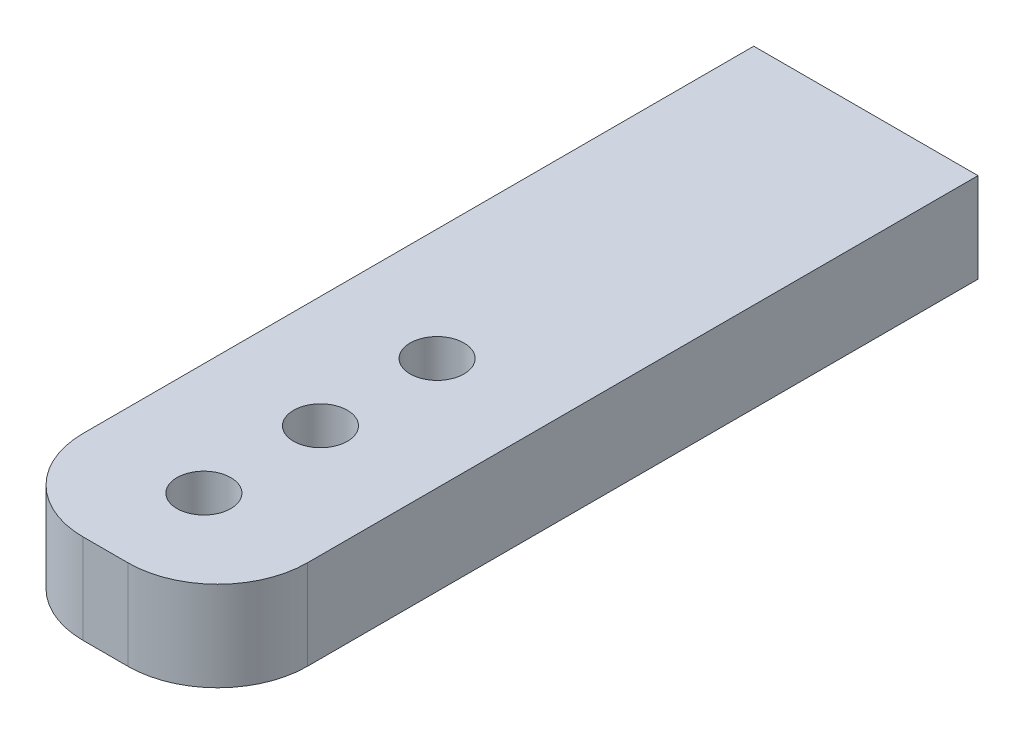
ISO-10303-21;
HEADER;
FILE_DESCRIPTION(('STEP AP214'),'2;1');
FILE_NAME('part.step','',(''),(''),'','','');
FILE_SCHEMA(('AUTOMOTIVE_DESIGN { 1 0 10303 214 1 1 1 1 }'));
ENDSEC;
DATA;
#1=APPLICATION_CONTEXT('core data for automotive mechanical design processes');
#2=APPLICATION_PROTOCOL_DEFINITION('international standard','automotive_design',2000,#1);
#3=PRODUCT_CONTEXT('',#1,'mechanical');
#4=PRODUCT('Part','Part','',(#3));
#5=PRODUCT_RELATED_PRODUCT_CATEGORY('part','',(#4));
#6=PRODUCT_DEFINITION_FORMATION('','',#4);
#7=PRODUCT_DEFINITION_CONTEXT('part definition',#1,'design');
#8=PRODUCT_DEFINITION('design','',#6,#7);
#9=PRODUCT_DEFINITION_SHAPE('','',#8);
#10=(LENGTH_UNIT() NAMED_UNIT(*) SI_UNIT(.MILLI.,.METRE.));
#11=(NAMED_UNIT(*) PLANE_ANGLE_UNIT() SI_UNIT($,.RADIAN.));
#12=(NAMED_UNIT(*) SI_UNIT($,.STERADIAN.) SOLID_ANGLE_UNIT());
#13=UNCERTAINTY_MEASURE_WITH_UNIT(LENGTH_MEASURE(1.E-05),#10,'distance_accuracy_value','');
#14=(GEOMETRIC_REPRESENTATION_CONTEXT(3) GLOBAL_UNCERTAINTY_ASSIGNED_CONTEXT((#13)) GLOBAL_UNIT_ASSIGNED_CONTEXT((#10,
#11,#12)) REPRESENTATION_CONTEXT('',''));
#15=CARTESIAN_POINT('',(0.,0.,0.));
#16=DIRECTION('',(0.,0.,1.));
#17=DIRECTION('',(1.,0.,0.));
#18=AXIS2_PLACEMENT_3D('',#15,#16,#17);
#19=CARTESIAN_POINT('',(-19.92,-9.18944444444445,3.30222222222222));
#20=DIRECTION('',(0.,1.,0.));
#21=DIRECTION('',(0.,0.,1.));
#22=AXIS2_PLACEMENT_3D('',#19,#20,#21);
#23=PLANE('',#22);
#24=DIRECTION('',(0.,0.,1.));
#25=VECTOR('',#24,1.);
#26=CARTESIAN_POINT('',(-21.17,-9.18944444444445,3.30222222222222));
#27=LINE('',#26,#25);
#28=CARTESIAN_POINT('',(-21.17,-9.18944444444445,10.78));
#29=VERTEX_POINT('',#28);
#30=CARTESIAN_POINT('',(-21.17,-9.18944444444445,3.30222222222222));
#31=VERTEX_POINT('',#30);
#32=EDGE_CURVE('E72',#29,#31,#27,.F.);
#33=ORIENTED_EDGE('',*,*,#32,.F.);
#34=CARTESIAN_POINT('',(-20.17,-9.18944444444445,10.78));
#35=DIRECTION('',(0.,1.,0.));
#36=DIRECTION('',(0.,0.,1.));
#37=AXIS2_PLACEMENT_3D('',#34,#35,#36);
#38=CIRCLE('',#37,1.);
#39=CARTESIAN_POINT('',(-20.17,-9.18944444444445,11.78));
#40=VERTEX_POINT('',#39);
#41=EDGE_CURVE('E66',#40,#29,#38,.F.);
#42=ORIENTED_EDGE('',*,*,#41,.F.);
#43=DIRECTION('',(1.,0.,0.));
#44=VECTOR('',#43,1.);
#45=CARTESIAN_POINT('',(-19.92,-9.18944444444445,11.78));
#46=LINE('',#45,#44);
#47=CARTESIAN_POINT('',(-19.67,-9.18944444444445,11.78));
#48=VERTEX_POINT('',#47);
#49=EDGE_CURVE('E69',#40,#48,#46,.T.);
#50=ORIENTED_EDGE('',*,*,#49,.T.);
#51=CARTESIAN_POINT('',(-19.67,-9.18944444444445,10.78));
#52=DIRECTION('',(0.,-1.,0.));
#53=DIRECTION('',(0.,0.,-1.));
#54=AXIS2_PLACEMENT_3D('',#51,#52,#53);
#55=CIRCLE('',#54,1.);
#56=CARTESIAN_POINT('',(-18.67,-9.18944444444445,10.78));
#57=VERTEX_POINT('',#56);
#58=EDGE_CURVE('E20',#48,#57,#55,.F.);
#59=ORIENTED_EDGE('',*,*,#58,.T.);
#60=DIRECTION('',(0.,0.,-1.));
#61=VECTOR('',#60,1.);
#62=CARTESIAN_POINT('',(-18.67,-9.18944444444445,3.30222222222222));
#63=LINE('',#62,#61);
#64=CARTESIAN_POINT('',(-18.67,-9.18944444444445,3.30222222222222));
#65=VERTEX_POINT('',#64);
#66=EDGE_CURVE('E96',#65,#57,#63,.F.);
#67=ORIENTED_EDGE('',*,*,#66,.F.);
#68=DIRECTION('',(1.,0.,0.));
#69=VECTOR('',#68,1.);
#70=CARTESIAN_POINT('',(-19.92,-9.18944444444445,3.30222222222222));
#71=LINE('',#70,#69);
#72=EDGE_CURVE('E112',#65,#31,#71,.F.);
#73=ORIENTED_EDGE('',*,*,#72,.T.);
#74=EDGE_LOOP('',(#33,#42,#50,#59,#67,#73));
#75=FACE_BOUND('',#74,.T.);
#76=CARTESIAN_POINT('',(-19.92,-9.18944444444442,10.6835169520579));
#77=DIRECTION('',(0.,-1.,0.));
#78=DIRECTION('',(0.,0.,-1.));
#79=AXIS2_PLACEMENT_3D('',#76,#77,#78);
#80=CIRCLE('',#79,0.3);
#81=CARTESIAN_POINT('',(-19.92,-9.18944444444442,10.3835169520579));
#82=VERTEX_POINT('',#81);
#83=EDGE_CURVE('E75',#82,#82,#80,.T.);
#84=ORIENTED_EDGE('',*,*,#83,.T.);
#85=EDGE_LOOP('',(#84));
#86=FACE_BOUND('',#85,.T.);
#87=CARTESIAN_POINT('',(-19.92,-9.18944444444443,9.38351695205794));
#88=DIRECTION('',(0.,-1.,0.));
#89=DIRECTION('',(0.,0.,-1.));
#90=AXIS2_PLACEMENT_3D('',#87,#88,#89);
#91=CIRCLE('',#90,0.3);
#92=CARTESIAN_POINT('',(-19.92,-9.18944444444443,9.08351695205794));
#93=VERTEX_POINT('',#92);
#94=EDGE_CURVE('E135',#93,#93,#91,.T.);
#95=ORIENTED_EDGE('',*,*,#94,.T.);
#96=EDGE_LOOP('',(#95));
#97=FACE_BOUND('',#96,.T.);
#98=CARTESIAN_POINT('',(-19.92,-9.18944444444443,8.08351695205794));
#99=DIRECTION('',(0.,-1.,0.));
#100=DIRECTION('',(0.,0.,-1.));
#101=AXIS2_PLACEMENT_3D('',#98,#99,#100);
#102=CIRCLE('',#101,0.3);
#103=CARTESIAN_POINT('',(-19.92,-9.18944444444443,7.78351695205794));
#104=VERTEX_POINT('',#103);
#105=EDGE_CURVE('E137',#104,#104,#102,.T.);
#106=ORIENTED_EDGE('',*,*,#105,.T.);
#107=EDGE_LOOP('',(#106));
#108=FACE_BOUND('',#107,.T.);
#109=ADVANCED_FACE('F17',(#75,#86,#97,#108),#23,.T.);
#110=CARTESIAN_POINT('',(-19.92,-9.18944444444446,8.08351695205794));
#111=DIRECTION('',(0.,-1.,0.));
#112=DIRECTION('',(0.,0.,-1.));
#113=AXIS2_PLACEMENT_3D('',#110,#111,#112);
#114=CYLINDRICAL_SURFACE('',#113,0.3);
#115=ORIENTED_EDGE('',*,*,#105,.F.);
#116=EDGE_LOOP('',(#115));
#117=FACE_BOUND('',#116,.T.);
#118=CARTESIAN_POINT('',(-19.92,-10.1894444444444,8.08351695205794));
#119=DIRECTION('',(0.,-1.,0.));
#120=DIRECTION('',(0.,0.,-1.));
#121=AXIS2_PLACEMENT_3D('',#118,#119,#120);
#122=CIRCLE('',#121,0.3);
#123=CARTESIAN_POINT('',(-19.92,-10.1894444444444,7.78351695205794));
#124=VERTEX_POINT('',#123);
#125=EDGE_CURVE('E84',#124,#124,#122,.F.);
#126=ORIENTED_EDGE('',*,*,#125,.F.);
#127=EDGE_LOOP('',(#126));
#128=FACE_BOUND('',#127,.T.);
#129=ADVANCED_FACE('F245',(#117,#128),#114,.F.);
#130=CARTESIAN_POINT('',(-19.92,-9.18944444444446,9.38351695205794));
#131=DIRECTION('',(0.,-1.,0.));
#132=DIRECTION('',(0.,0.,-1.));
#133=AXIS2_PLACEMENT_3D('',#130,#131,#132);
#134=CYLINDRICAL_SURFACE('',#133,0.3);
#135=ORIENTED_EDGE('',*,*,#94,.F.);
#136=EDGE_LOOP('',(#135));
#137=FACE_BOUND('',#136,.T.);
#138=CARTESIAN_POINT('',(-19.92,-10.1894444444444,9.38351695205794));
#139=DIRECTION('',(0.,-1.,0.));
#140=DIRECTION('',(0.,0.,-1.));
#141=AXIS2_PLACEMENT_3D('',#138,#139,#140);
#142=CIRCLE('',#141,0.3);
#143=CARTESIAN_POINT('',(-19.92,-10.1894444444444,9.08351695205794));
#144=VERTEX_POINT('',#143);
#145=EDGE_CURVE('E87',#144,#144,#142,.F.);
#146=ORIENTED_EDGE('',*,*,#145,.F.);
#147=EDGE_LOOP('',(#146));
#148=FACE_BOUND('',#147,.T.);
#149=ADVANCED_FACE('F236',(#137,#148),#134,.F.);
#150=CARTESIAN_POINT('',(-19.92,-9.18944444444446,10.6835169520579));
#151=DIRECTION('',(0.,-1.,0.));
#152=DIRECTION('',(0.,0.,-1.));
#153=AXIS2_PLACEMENT_3D('',#150,#151,#152);
#154=CYLINDRICAL_SURFACE('',#153,0.3);
#155=ORIENTED_EDGE('',*,*,#83,.F.);
#156=EDGE_LOOP('',(#155));
#157=FACE_BOUND('',#156,.T.);
#158=CARTESIAN_POINT('',(-19.92,-10.1894444444444,10.6835169520579));
#159=DIRECTION('',(0.,-1.,0.));
#160=DIRECTION('',(0.,0.,-1.));
#161=AXIS2_PLACEMENT_3D('',#158,#159,#160);
#162=CIRCLE('',#161,0.3);
#163=CARTESIAN_POINT('',(-19.92,-10.1894444444444,10.3835169520579));
#164=VERTEX_POINT('',#163);
#165=EDGE_CURVE('E128',#164,#164,#162,.F.);
#166=ORIENTED_EDGE('',*,*,#165,.F.);
#167=EDGE_LOOP('',(#166));
#168=FACE_BOUND('',#167,.T.);
#169=ADVANCED_FACE('F174',(#157,#168),#154,.F.);
#170=CARTESIAN_POINT('',(-21.17,-9.68944444444445,3.30222222222222));
#171=DIRECTION('',(-1.,0.,0.));
#172=DIRECTION('',(0.,0.,1.));
#173=AXIS2_PLACEMENT_3D('',#170,#171,#172);
#174=PLANE('',#173);
#175=DIRECTION('',(0.,1.,0.));
#176=VECTOR('',#175,1.);
#177=CARTESIAN_POINT('',(-21.17,-9.68944444444445,3.30222222222222));
#178=LINE('',#177,#176);
#179=CARTESIAN_POINT('',(-21.17,-10.1894444444444,3.30222222222222));
#180=VERTEX_POINT('',#179);
#181=EDGE_CURVE('E100',#31,#180,#178,.F.);
#182=ORIENTED_EDGE('',*,*,#181,.T.);
#183=DIRECTION('',(0.,0.,-1.));
#184=VECTOR('',#183,1.);
#185=CARTESIAN_POINT('',(-21.17,-10.1894444444444,3.30222222222222));
#186=LINE('',#185,#184);
#187=CARTESIAN_POINT('',(-21.17,-10.1894444444444,10.78));
#188=VERTEX_POINT('',#187);
#189=EDGE_CURVE('E107',#188,#180,#186,.T.);
#190=ORIENTED_EDGE('',*,*,#189,.F.);
#191=DIRECTION('',(0.,1.,0.));
#192=VECTOR('',#191,1.);
#193=CARTESIAN_POINT('',(-21.17,-9.68944444444445,10.78));
#194=LINE('',#193,#192);
#195=EDGE_CURVE('E74',#188,#29,#194,.T.);
#196=ORIENTED_EDGE('',*,*,#195,.T.);
#197=ORIENTED_EDGE('',*,*,#32,.T.);
#198=EDGE_LOOP('',(#182,#190,#196,#197));
#199=FACE_BOUND('',#198,.T.);
#200=ADVANCED_FACE('F160',(#199),#174,.T.);
#201=CARTESIAN_POINT('',(-19.92,-9.68944444444445,3.30222222222222));
#202=DIRECTION('',(0.,0.,1.));
#203=DIRECTION('',(1.,0.,0.));
#204=AXIS2_PLACEMENT_3D('',#201,#202,#203);
#205=PLANE('',#204);
#206=ORIENTED_EDGE('',*,*,#181,.F.);
#207=ORIENTED_EDGE('',*,*,#72,.F.);
#208=DIRECTION('',(0.,1.,0.));
#209=VECTOR('',#208,1.);
#210=CARTESIAN_POINT('',(-18.67,-9.68944444444445,3.30222222222222));
#211=LINE('',#210,#209);
#212=CARTESIAN_POINT('',(-18.67,-10.1894444444444,3.30222222222222));
#213=VERTEX_POINT('',#212);
#214=EDGE_CURVE('E97',#213,#65,#211,.T.);
#215=ORIENTED_EDGE('',*,*,#214,.F.);
#216=DIRECTION('',(1.,0.,0.));
#217=VECTOR('',#216,1.);
#218=CARTESIAN_POINT('',(-19.92,-10.1894444444444,3.30222222222222));
#219=LINE('',#218,#217);
#220=EDGE_CURVE('E103',#180,#213,#219,.T.);
#221=ORIENTED_EDGE('',*,*,#220,.F.);
#222=EDGE_LOOP('',(#206,#207,#215,#221));
#223=FACE_BOUND('',#222,.T.);
#224=ADVANCED_FACE('F164',(#223),#205,.F.);
#225=CARTESIAN_POINT('',(-18.67,-9.68944444444445,3.30222222222222));
#226=DIRECTION('',(1.,0.,0.));
#227=DIRECTION('',(0.,0.,-1.));
#228=AXIS2_PLACEMENT_3D('',#225,#226,#227);
#229=PLANE('',#228);
#230=ORIENTED_EDGE('',*,*,#214,.T.);
#231=ORIENTED_EDGE('',*,*,#66,.T.);
#232=DIRECTION('',(0.,-1.,0.));
#233=VECTOR('',#232,1.);
#234=CARTESIAN_POINT('',(-18.67,-9.68944444444445,10.78));
#235=LINE('',#234,#233);
#236=CARTESIAN_POINT('',(-18.67,-10.1894444444444,10.78));
#237=VERTEX_POINT('',#236);
#238=EDGE_CURVE('E89',#237,#57,#235,.F.);
#239=ORIENTED_EDGE('',*,*,#238,.F.);
#240=DIRECTION('',(0.,0.,-1.));
#241=VECTOR('',#240,1.);
#242=CARTESIAN_POINT('',(-18.67,-10.1894444444444,3.30222222222222));
#243=LINE('',#242,#241);
#244=EDGE_CURVE('E106',#213,#237,#243,.F.);
#245=ORIENTED_EDGE('',*,*,#244,.F.);
#246=EDGE_LOOP('',(#230,#231,#239,#245));
#247=FACE_BOUND('',#246,.T.);
#248=ADVANCED_FACE('F143',(#247),#229,.T.);
#249=CARTESIAN_POINT('',(-19.67,-9.68944444444445,10.78));
#250=DIRECTION('',(0.,-1.,0.));
#251=DIRECTION('',(0.,0.,-1.));
#252=AXIS2_PLACEMENT_3D('',#249,#250,#251);
#253=CYLINDRICAL_SURFACE('',#252,1.);
#254=DIRECTION('',(0.,1.,0.));
#255=VECTOR('',#254,1.);
#256=CARTESIAN_POINT('',(-19.67,-9.68944444444445,11.78));
#257=LINE('',#256,#255);
#258=CARTESIAN_POINT('',(-19.67,-10.1894444444444,11.78));
#259=VERTEX_POINT('',#258);
#260=EDGE_CURVE('E81',#259,#48,#257,.T.);
#261=ORIENTED_EDGE('',*,*,#260,.F.);
#262=CARTESIAN_POINT('',(-19.67,-10.1894444444444,10.78));
#263=DIRECTION('',(0.,-1.,0.));
#264=DIRECTION('',(0.,0.,-1.));
#265=AXIS2_PLACEMENT_3D('',#262,#263,#264);
#266=CIRCLE('',#265,1.);
#267=EDGE_CURVE('E26',#237,#259,#266,.T.);
#268=ORIENTED_EDGE('',*,*,#267,.F.);
#269=ORIENTED_EDGE('',*,*,#238,.T.);
#270=ORIENTED_EDGE('',*,*,#58,.F.);
#271=EDGE_LOOP('',(#261,#268,#269,#270));
#272=FACE_BOUND('',#271,.T.);
#273=ADVANCED_FACE('F147',(#272),#253,.T.);
#274=CARTESIAN_POINT('',(-19.92,-9.68944444444445,11.78));
#275=DIRECTION('',(0.,0.,1.));
#276=DIRECTION('',(1.,0.,0.));
#277=AXIS2_PLACEMENT_3D('',#274,#275,#276);
#278=PLANE('',#277);
#279=ORIENTED_EDGE('',*,*,#260,.T.);
#280=ORIENTED_EDGE('',*,*,#49,.F.);
#281=DIRECTION('',(0.,1.,0.));
#282=VECTOR('',#281,1.);
#283=CARTESIAN_POINT('',(-20.17,-9.68944444444445,11.78));
#284=LINE('',#283,#282);
#285=CARTESIAN_POINT('',(-20.17,-10.1894444444444,11.78));
#286=VERTEX_POINT('',#285);
#287=EDGE_CURVE('E80',#286,#40,#284,.T.);
#288=ORIENTED_EDGE('',*,*,#287,.F.);
#289=DIRECTION('',(1.,0.,0.));
#290=VECTOR('',#289,1.);
#291=CARTESIAN_POINT('',(-19.92,-10.1894444444444,11.78));
#292=LINE('',#291,#290);
#293=EDGE_CURVE('E11',#259,#286,#292,.F.);
#294=ORIENTED_EDGE('',*,*,#293,.F.);
#295=EDGE_LOOP('',(#279,#280,#288,#294));
#296=FACE_BOUND('',#295,.T.);
#297=ADVANCED_FACE('F78',(#296),#278,.T.);
#298=CARTESIAN_POINT('',(-20.17,-9.68944444444445,10.78));
#299=DIRECTION('',(0.,1.,0.));
#300=DIRECTION('',(0.,0.,1.));
#301=AXIS2_PLACEMENT_3D('',#298,#299,#300);
#302=CYLINDRICAL_SURFACE('',#301,1.);
#303=ORIENTED_EDGE('',*,*,#287,.T.);
#304=ORIENTED_EDGE('',*,*,#41,.T.);
#305=ORIENTED_EDGE('',*,*,#195,.F.);
#306=CARTESIAN_POINT('',(-20.17,-10.1894444444444,10.78));
#307=DIRECTION('',(0.,1.,0.));
#308=DIRECTION('',(0.,0.,1.));
#309=AXIS2_PLACEMENT_3D('',#306,#307,#308);
#310=CIRCLE('',#309,1.);
#311=EDGE_CURVE('E35',#286,#188,#310,.F.);
#312=ORIENTED_EDGE('',*,*,#311,.F.);
#313=EDGE_LOOP('',(#303,#304,#305,#312));
#314=FACE_BOUND('',#313,.T.);
#315=ADVANCED_FACE('F83',(#314),#302,.T.);
#316=CARTESIAN_POINT('',(-19.92,-10.1894444444444,3.30222222222222));
#317=DIRECTION('',(0.,-1.,0.));
#318=DIRECTION('',(0.,0.,-1.));
#319=AXIS2_PLACEMENT_3D('',#316,#317,#318);
#320=PLANE('',#319);
#321=ORIENTED_EDGE('',*,*,#293,.T.);
#322=ORIENTED_EDGE('',*,*,#311,.T.);
#323=ORIENTED_EDGE('',*,*,#189,.T.);
#324=ORIENTED_EDGE('',*,*,#220,.T.);
#325=ORIENTED_EDGE('',*,*,#244,.T.);
#326=ORIENTED_EDGE('',*,*,#267,.T.);
#327=EDGE_LOOP('',(#321,#322,#323,#324,#325,#326));
#328=FACE_BOUND('',#327,.T.);
#329=ORIENTED_EDGE('',*,*,#165,.T.);
#330=EDGE_LOOP('',(#329));
#331=FACE_BOUND('',#330,.T.);
#332=ORIENTED_EDGE('',*,*,#145,.T.);
#333=EDGE_LOOP('',(#332));
#334=FACE_BOUND('',#333,.T.);
#335=ORIENTED_EDGE('',*,*,#125,.T.);
#336=EDGE_LOOP('',(#335));
#337=FACE_BOUND('',#336,.T.);
#338=ADVANCED_FACE('F150',(#328,#331,#334,#337),#320,.T.);
#339=CLOSED_SHELL('',(#109,#129,#149,#169,#200,#224,#248,#273,#297,#315,#338));
#340=MANIFOLD_SOLID_BREP('B1',#339);
#341=ADVANCED_BREP_SHAPE_REPRESENTATION('',(#18,#340),#14);
#342=SHAPE_DEFINITION_REPRESENTATION(#9,#341);
ENDSEC;
END-ISO-10303-21;
